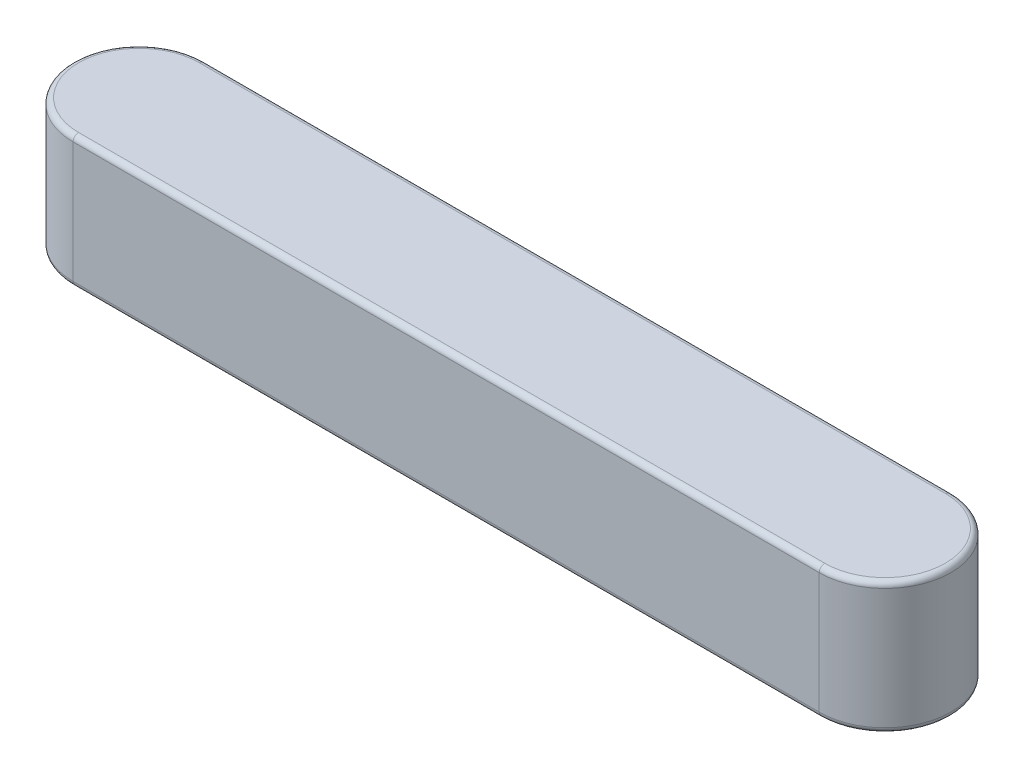
ISO-10303-21;
HEADER;
FILE_DESCRIPTION(('STEP AP214'),'2;1');
FILE_NAME('part.step','',(''),(''),'','','');
FILE_SCHEMA(('AUTOMOTIVE_DESIGN { 1 0 10303 214 1 1 1 1 }'));
ENDSEC;
DATA;
#1=APPLICATION_CONTEXT('core data for automotive mechanical design processes');
#2=APPLICATION_PROTOCOL_DEFINITION('international standard','automotive_design',2000,#1);
#3=PRODUCT_CONTEXT('',#1,'mechanical');
#4=PRODUCT('Part','Part','',(#3));
#5=PRODUCT_RELATED_PRODUCT_CATEGORY('part','',(#4));
#6=PRODUCT_DEFINITION_FORMATION('','',#4);
#7=PRODUCT_DEFINITION_CONTEXT('part definition',#1,'design');
#8=PRODUCT_DEFINITION('design','',#6,#7);
#9=PRODUCT_DEFINITION_SHAPE('','',#8);
#10=(LENGTH_UNIT() NAMED_UNIT(*) SI_UNIT(.MILLI.,.METRE.));
#11=(NAMED_UNIT(*) PLANE_ANGLE_UNIT() SI_UNIT($,.RADIAN.));
#12=(NAMED_UNIT(*) SI_UNIT($,.STERADIAN.) SOLID_ANGLE_UNIT());
#13=UNCERTAINTY_MEASURE_WITH_UNIT(LENGTH_MEASURE(1.E-05),#10,'distance_accuracy_value','');
#14=(GEOMETRIC_REPRESENTATION_CONTEXT(3) GLOBAL_UNCERTAINTY_ASSIGNED_CONTEXT((#13)) GLOBAL_UNIT_ASSIGNED_CONTEXT((#10,
#11,#12)) REPRESENTATION_CONTEXT('',''));
#15=CARTESIAN_POINT('',(0.,0.,0.));
#16=DIRECTION('',(0.,0.,1.));
#17=DIRECTION('',(1.,0.,0.));
#18=AXIS2_PLACEMENT_3D('',#15,#16,#17);
#19=CARTESIAN_POINT('',(-34.,6.,0.));
#20=DIRECTION('',(0.,-1.,0.));
#21=DIRECTION('',(0.,0.,-1.));
#22=AXIS2_PLACEMENT_3D('',#19,#20,#21);
#23=CYLINDRICAL_SURFACE('',#22,3.);
#24=DIRECTION('',(0.,-1.,0.));
#25=VECTOR('',#24,1.);
#26=CARTESIAN_POINT('',(-34.,6.,-3.));
#27=LINE('',#26,#25);
#28=CARTESIAN_POINT('',(-34.,5.75,-3.));
#29=VERTEX_POINT('',#28);
#30=CARTESIAN_POINT('',(-34.,0.25,-3.));
#31=VERTEX_POINT('',#30);
#32=EDGE_CURVE('E105',#29,#31,#27,.T.);
#33=ORIENTED_EDGE('',*,*,#32,.T.);
#34=CARTESIAN_POINT('',(-34.,0.25,0.));
#35=DIRECTION('',(0.,1.,0.));
#36=DIRECTION('',(0.,0.,1.));
#37=AXIS2_PLACEMENT_3D('',#34,#35,#36);
#38=CIRCLE('',#37,3.);
#39=CARTESIAN_POINT('',(-34.,0.25,3.));
#40=VERTEX_POINT('',#39);
#41=EDGE_CURVE('E112',#31,#40,#38,.T.);
#42=ORIENTED_EDGE('',*,*,#41,.T.);
#43=DIRECTION('',(0.,-1.,0.));
#44=VECTOR('',#43,1.);
#45=CARTESIAN_POINT('',(-34.,6.,3.));
#46=LINE('',#45,#44);
#47=CARTESIAN_POINT('',(-34.,5.75,3.));
#48=VERTEX_POINT('',#47);
#49=EDGE_CURVE('E107',#48,#40,#46,.T.);
#50=ORIENTED_EDGE('',*,*,#49,.F.);
#51=CARTESIAN_POINT('',(-34.,5.75,0.));
#52=DIRECTION('',(0.,1.,0.));
#53=DIRECTION('',(0.,0.,1.));
#54=AXIS2_PLACEMENT_3D('',#51,#52,#53);
#55=CIRCLE('',#54,3.);
#56=EDGE_CURVE('E103',#48,#29,#55,.F.);
#57=ORIENTED_EDGE('',*,*,#56,.T.);
#58=EDGE_LOOP('',(#33,#42,#50,#57));
#59=FACE_BOUND('',#58,.T.);
#60=ADVANCED_FACE('F34',(#59),#23,.T.);
#61=CARTESIAN_POINT('',(-34.,6.,3.));
#62=DIRECTION('',(0.,0.,-1.));
#63=DIRECTION('',(-1.,0.,0.));
#64=AXIS2_PLACEMENT_3D('',#61,#62,#63);
#65=PLANE('',#64);
#66=ORIENTED_EDGE('',*,*,#49,.T.);
#67=DIRECTION('',(1.,0.,0.));
#68=VECTOR('',#67,1.);
#69=CARTESIAN_POINT('',(-34.,0.25,3.));
#70=LINE('',#69,#68);
#71=CARTESIAN_POINT('',(0.,0.25,3.));
#72=VERTEX_POINT('',#71);
#73=EDGE_CURVE('E156',#40,#72,#70,.T.);
#74=ORIENTED_EDGE('',*,*,#73,.T.);
#75=DIRECTION('',(0.,-1.,0.));
#76=VECTOR('',#75,1.);
#77=CARTESIAN_POINT('',(0.,6.,3.));
#78=LINE('',#77,#76);
#79=CARTESIAN_POINT('',(0.,5.75,3.));
#80=VERTEX_POINT('',#79);
#81=EDGE_CURVE('E137',#80,#72,#78,.T.);
#82=ORIENTED_EDGE('',*,*,#81,.F.);
#83=DIRECTION('',(1.,0.,0.));
#84=VECTOR('',#83,1.);
#85=CARTESIAN_POINT('',(-34.,5.75,3.));
#86=LINE('',#85,#84);
#87=EDGE_CURVE('E154',#80,#48,#86,.F.);
#88=ORIENTED_EDGE('',*,*,#87,.T.);
#89=EDGE_LOOP('',(#66,#74,#82,#88));
#90=FACE_BOUND('',#89,.T.);
#91=ADVANCED_FACE('F182',(#90),#65,.F.);
#92=CARTESIAN_POINT('',(0.,6.,0.));
#93=DIRECTION('',(0.,-1.,0.));
#94=DIRECTION('',(0.,0.,-1.));
#95=AXIS2_PLACEMENT_3D('',#92,#93,#94);
#96=CYLINDRICAL_SURFACE('',#95,3.);
#97=ORIENTED_EDGE('',*,*,#81,.T.);
#98=CARTESIAN_POINT('',(0.,0.25,0.));
#99=DIRECTION('',(0.,1.,0.));
#100=DIRECTION('',(0.,0.,1.));
#101=AXIS2_PLACEMENT_3D('',#98,#99,#100);
#102=CIRCLE('',#101,3.);
#103=CARTESIAN_POINT('',(0.,0.25,-3.));
#104=VERTEX_POINT('',#103);
#105=EDGE_CURVE('E113',#72,#104,#102,.T.);
#106=ORIENTED_EDGE('',*,*,#105,.T.);
#107=DIRECTION('',(0.,-1.,0.));
#108=VECTOR('',#107,1.);
#109=CARTESIAN_POINT('',(0.,6.,-3.));
#110=LINE('',#109,#108);
#111=CARTESIAN_POINT('',(0.,5.75,-3.));
#112=VERTEX_POINT('',#111);
#113=EDGE_CURVE('E124',#112,#104,#110,.T.);
#114=ORIENTED_EDGE('',*,*,#113,.F.);
#115=CARTESIAN_POINT('',(0.,5.75,0.));
#116=DIRECTION('',(0.,1.,0.));
#117=DIRECTION('',(0.,0.,1.));
#118=AXIS2_PLACEMENT_3D('',#115,#116,#117);
#119=CIRCLE('',#118,3.);
#120=EDGE_CURVE('E149',#112,#80,#119,.F.);
#121=ORIENTED_EDGE('',*,*,#120,.T.);
#122=EDGE_LOOP('',(#97,#106,#114,#121));
#123=FACE_BOUND('',#122,.T.);
#124=ADVANCED_FACE('F180',(#123),#96,.T.);
#125=CARTESIAN_POINT('',(-34.,6.,-3.));
#126=DIRECTION('',(0.,0.,1.));
#127=DIRECTION('',(1.,0.,0.));
#128=AXIS2_PLACEMENT_3D('',#125,#126,#127);
#129=PLANE('',#128);
#130=ORIENTED_EDGE('',*,*,#113,.T.);
#131=DIRECTION('',(-1.,0.,0.));
#132=VECTOR('',#131,1.);
#133=CARTESIAN_POINT('',(-34.,0.25,-3.));
#134=LINE('',#133,#132);
#135=EDGE_CURVE('E123',#104,#31,#134,.T.);
#136=ORIENTED_EDGE('',*,*,#135,.T.);
#137=ORIENTED_EDGE('',*,*,#32,.F.);
#138=DIRECTION('',(-1.,0.,0.));
#139=VECTOR('',#138,1.);
#140=CARTESIAN_POINT('',(0.,5.75,-3.));
#141=LINE('',#140,#139);
#142=EDGE_CURVE('E120',#29,#112,#141,.F.);
#143=ORIENTED_EDGE('',*,*,#142,.T.);
#144=EDGE_LOOP('',(#130,#136,#137,#143));
#145=FACE_BOUND('',#144,.T.);
#146=ADVANCED_FACE('F118',(#145),#129,.F.);
#147=CARTESIAN_POINT('',(-34.,6.,0.));
#148=DIRECTION('',(0.,1.,0.));
#149=DIRECTION('',(0.,0.,1.));
#150=AXIS2_PLACEMENT_3D('',#147,#148,#149);
#151=PLANE('',#150);
#152=DIRECTION('',(1.,0.,0.));
#153=VECTOR('',#152,1.);
#154=CARTESIAN_POINT('',(0.,6.,2.75));
#155=LINE('',#154,#153);
#156=CARTESIAN_POINT('',(-34.,6.,2.75));
#157=VERTEX_POINT('',#156);
#158=CARTESIAN_POINT('',(0.,6.,2.75));
#159=VERTEX_POINT('',#158);
#160=EDGE_CURVE('E43',#157,#159,#155,.T.);
#161=ORIENTED_EDGE('',*,*,#160,.T.);
#162=CARTESIAN_POINT('',(0.,6.,0.));
#163=DIRECTION('',(0.,1.,0.));
#164=DIRECTION('',(0.,0.,1.));
#165=AXIS2_PLACEMENT_3D('',#162,#163,#164);
#166=CIRCLE('',#165,2.75);
#167=CARTESIAN_POINT('',(0.,6.,-2.75));
#168=VERTEX_POINT('',#167);
#169=EDGE_CURVE('E11',#159,#168,#166,.T.);
#170=ORIENTED_EDGE('',*,*,#169,.T.);
#171=DIRECTION('',(-1.,0.,0.));
#172=VECTOR('',#171,1.);
#173=CARTESIAN_POINT('',(-34.,6.,-2.75));
#174=LINE('',#173,#172);
#175=CARTESIAN_POINT('',(-34.,6.,-2.75));
#176=VERTEX_POINT('',#175);
#177=EDGE_CURVE('E159',#168,#176,#174,.T.);
#178=ORIENTED_EDGE('',*,*,#177,.T.);
#179=CARTESIAN_POINT('',(-34.,6.,0.));
#180=DIRECTION('',(0.,1.,0.));
#181=DIRECTION('',(0.,0.,1.));
#182=AXIS2_PLACEMENT_3D('',#179,#180,#181);
#183=CIRCLE('',#182,2.75);
#184=EDGE_CURVE('E130',#176,#157,#183,.T.);
#185=ORIENTED_EDGE('',*,*,#184,.T.);
#186=EDGE_LOOP('',(#161,#170,#178,#185));
#187=FACE_BOUND('',#186,.T.);
#188=ADVANCED_FACE('F205',(#187),#151,.T.);
#189=CARTESIAN_POINT('',(-34.,0.,0.));
#190=DIRECTION('',(0.,1.,0.));
#191=DIRECTION('',(0.,0.,1.));
#192=AXIS2_PLACEMENT_3D('',#189,#190,#191);
#193=PLANE('',#192);
#194=CARTESIAN_POINT('',(-34.,0.,0.));
#195=DIRECTION('',(0.,1.,0.));
#196=DIRECTION('',(0.,0.,1.));
#197=AXIS2_PLACEMENT_3D('',#194,#195,#196);
#198=CIRCLE('',#197,2.75);
#199=CARTESIAN_POINT('',(-34.,0.,2.75));
#200=VERTEX_POINT('',#199);
#201=CARTESIAN_POINT('',(-34.,0.,-2.75));
#202=VERTEX_POINT('',#201);
#203=EDGE_CURVE('E142',#200,#202,#198,.F.);
#204=ORIENTED_EDGE('',*,*,#203,.T.);
#205=DIRECTION('',(-1.,0.,0.));
#206=VECTOR('',#205,1.);
#207=CARTESIAN_POINT('',(-34.,0.,-2.75));
#208=LINE('',#207,#206);
#209=CARTESIAN_POINT('',(0.,0.,-2.75));
#210=VERTEX_POINT('',#209);
#211=EDGE_CURVE('E146',#202,#210,#208,.F.);
#212=ORIENTED_EDGE('',*,*,#211,.T.);
#213=CARTESIAN_POINT('',(0.,0.,0.));
#214=DIRECTION('',(0.,1.,0.));
#215=DIRECTION('',(0.,0.,1.));
#216=AXIS2_PLACEMENT_3D('',#213,#214,#215);
#217=CIRCLE('',#216,2.75);
#218=CARTESIAN_POINT('',(0.,0.,2.75));
#219=VERTEX_POINT('',#218);
#220=EDGE_CURVE('E144',#210,#219,#217,.F.);
#221=ORIENTED_EDGE('',*,*,#220,.T.);
#222=DIRECTION('',(1.,0.,0.));
#223=VECTOR('',#222,1.);
#224=CARTESIAN_POINT('',(-34.,0.,2.75));
#225=LINE('',#224,#223);
#226=EDGE_CURVE('E135',#219,#200,#225,.F.);
#227=ORIENTED_EDGE('',*,*,#226,.T.);
#228=EDGE_LOOP('',(#204,#212,#221,#227));
#229=FACE_BOUND('',#228,.T.);
#230=ADVANCED_FACE('F203',(#229),#193,.F.);
#231=CARTESIAN_POINT('',(-34.,0.25,2.75));
#232=DIRECTION('',(1.,0.,0.));
#233=DIRECTION('',(0.,0.,-1.));
#234=AXIS2_PLACEMENT_3D('',#231,#232,#233);
#235=CYLINDRICAL_SURFACE('',#234,0.25);
#236=CARTESIAN_POINT('',(-34.,0.25,2.75));
#237=DIRECTION('',(-1.,0.,0.));
#238=DIRECTION('',(0.,0.,1.));
#239=AXIS2_PLACEMENT_3D('',#236,#237,#238);
#240=CIRCLE('',#239,0.25);
#241=EDGE_CURVE('E166',#200,#40,#240,.T.);
#242=ORIENTED_EDGE('',*,*,#241,.F.);
#243=ORIENTED_EDGE('',*,*,#226,.F.);
#244=CARTESIAN_POINT('',(0.,0.25,2.75));
#245=DIRECTION('',(1.,0.,0.));
#246=DIRECTION('',(0.,0.,-1.));
#247=AXIS2_PLACEMENT_3D('',#244,#245,#246);
#248=CIRCLE('',#247,0.25);
#249=EDGE_CURVE('E125',#72,#219,#248,.T.);
#250=ORIENTED_EDGE('',*,*,#249,.F.);
#251=ORIENTED_EDGE('',*,*,#73,.F.);
#252=EDGE_LOOP('',(#242,#243,#250,#251));
#253=FACE_BOUND('',#252,.T.);
#254=ADVANCED_FACE('F200',(#253),#235,.T.);
#255=CARTESIAN_POINT('',(0.,0.25,0.));
#256=DIRECTION('',(0.,1.,0.));
#257=DIRECTION('',(0.,0.,1.));
#258=AXIS2_PLACEMENT_3D('',#255,#256,#257);
#259=TOROIDAL_SURFACE('',#258,2.75,0.25);
#260=ORIENTED_EDGE('',*,*,#249,.T.);
#261=ORIENTED_EDGE('',*,*,#220,.F.);
#262=CARTESIAN_POINT('',(0.,0.25,-2.75));
#263=DIRECTION('',(-1.,0.,0.));
#264=DIRECTION('',(0.,0.,1.));
#265=AXIS2_PLACEMENT_3D('',#262,#263,#264);
#266=CIRCLE('',#265,0.25);
#267=EDGE_CURVE('E164',#104,#210,#266,.T.);
#268=ORIENTED_EDGE('',*,*,#267,.F.);
#269=ORIENTED_EDGE('',*,*,#105,.F.);
#270=EDGE_LOOP('',(#260,#261,#268,#269));
#271=FACE_BOUND('',#270,.T.);
#272=ADVANCED_FACE('F189',(#271),#259,.T.);
#273=CARTESIAN_POINT('',(-34.,0.25,0.));
#274=DIRECTION('',(0.,1.,0.));
#275=DIRECTION('',(0.,0.,1.));
#276=AXIS2_PLACEMENT_3D('',#273,#274,#275);
#277=TOROIDAL_SURFACE('',#276,2.75,0.25);
#278=ORIENTED_EDGE('',*,*,#241,.T.);
#279=ORIENTED_EDGE('',*,*,#41,.F.);
#280=CARTESIAN_POINT('',(-34.,0.25,-2.75));
#281=DIRECTION('',(1.,0.,0.));
#282=DIRECTION('',(0.,0.,-1.));
#283=AXIS2_PLACEMENT_3D('',#280,#281,#282);
#284=CIRCLE('',#283,0.25);
#285=EDGE_CURVE('E162',#202,#31,#284,.T.);
#286=ORIENTED_EDGE('',*,*,#285,.F.);
#287=ORIENTED_EDGE('',*,*,#203,.F.);
#288=EDGE_LOOP('',(#278,#279,#286,#287));
#289=FACE_BOUND('',#288,.T.);
#290=ADVANCED_FACE('F197',(#289),#277,.T.);
#291=CARTESIAN_POINT('',(-34.,0.25,-2.75));
#292=DIRECTION('',(-1.,0.,0.));
#293=DIRECTION('',(0.,0.,1.));
#294=AXIS2_PLACEMENT_3D('',#291,#292,#293);
#295=CYLINDRICAL_SURFACE('',#294,0.25);
#296=ORIENTED_EDGE('',*,*,#267,.T.);
#297=ORIENTED_EDGE('',*,*,#211,.F.);
#298=ORIENTED_EDGE('',*,*,#285,.T.);
#299=ORIENTED_EDGE('',*,*,#135,.F.);
#300=EDGE_LOOP('',(#296,#297,#298,#299));
#301=FACE_BOUND('',#300,.T.);
#302=ADVANCED_FACE('F192',(#301),#295,.T.);
#303=CARTESIAN_POINT('',(-34.,5.75,0.));
#304=DIRECTION('',(0.,1.,0.));
#305=DIRECTION('',(0.,0.,1.));
#306=AXIS2_PLACEMENT_3D('',#303,#304,#305);
#307=TOROIDAL_SURFACE('',#306,2.75,0.25);
#308=CARTESIAN_POINT('',(-34.,5.75,-2.75));
#309=DIRECTION('',(1.,0.,0.));
#310=DIRECTION('',(0.,0.,-1.));
#311=AXIS2_PLACEMENT_3D('',#308,#309,#310);
#312=CIRCLE('',#311,0.25);
#313=EDGE_CURVE('E129',#29,#176,#312,.T.);
#314=ORIENTED_EDGE('',*,*,#313,.F.);
#315=ORIENTED_EDGE('',*,*,#56,.F.);
#316=CARTESIAN_POINT('',(-34.,5.75,2.75));
#317=DIRECTION('',(1.,0.,0.));
#318=DIRECTION('',(0.,0.,-1.));
#319=AXIS2_PLACEMENT_3D('',#316,#317,#318);
#320=CIRCLE('',#319,0.25);
#321=EDGE_CURVE('E38',#157,#48,#320,.T.);
#322=ORIENTED_EDGE('',*,*,#321,.F.);
#323=ORIENTED_EDGE('',*,*,#184,.F.);
#324=EDGE_LOOP('',(#314,#315,#322,#323));
#325=FACE_BOUND('',#324,.T.);
#326=ADVANCED_FACE('F36',(#325),#307,.T.);
#327=CARTESIAN_POINT('',(-34.,5.75,2.75));
#328=DIRECTION('',(-1.,0.,0.));
#329=DIRECTION('',(0.,0.,1.));
#330=AXIS2_PLACEMENT_3D('',#327,#328,#329);
#331=CYLINDRICAL_SURFACE('',#330,0.25);
#332=ORIENTED_EDGE('',*,*,#321,.T.);
#333=ORIENTED_EDGE('',*,*,#87,.F.);
#334=CARTESIAN_POINT('',(0.,5.75,2.75));
#335=DIRECTION('',(1.,0.,0.));
#336=DIRECTION('',(0.,0.,-1.));
#337=AXIS2_PLACEMENT_3D('',#334,#335,#336);
#338=CIRCLE('',#337,0.25);
#339=EDGE_CURVE('E132',#159,#80,#338,.T.);
#340=ORIENTED_EDGE('',*,*,#339,.F.);
#341=ORIENTED_EDGE('',*,*,#160,.F.);
#342=EDGE_LOOP('',(#332,#333,#340,#341));
#343=FACE_BOUND('',#342,.T.);
#344=ADVANCED_FACE('F175',(#343),#331,.T.);
#345=CARTESIAN_POINT('',(-34.,5.75,-2.75));
#346=DIRECTION('',(1.,0.,0.));
#347=DIRECTION('',(0.,0.,-1.));
#348=AXIS2_PLACEMENT_3D('',#345,#346,#347);
#349=CYLINDRICAL_SURFACE('',#348,0.25);
#350=ORIENTED_EDGE('',*,*,#313,.T.);
#351=ORIENTED_EDGE('',*,*,#177,.F.);
#352=CARTESIAN_POINT('',(0.,5.75,-2.75));
#353=DIRECTION('',(1.,0.,0.));
#354=DIRECTION('',(0.,0.,-1.));
#355=AXIS2_PLACEMENT_3D('',#352,#353,#354);
#356=CIRCLE('',#355,0.25);
#357=EDGE_CURVE('E57',#112,#168,#356,.T.);
#358=ORIENTED_EDGE('',*,*,#357,.F.);
#359=ORIENTED_EDGE('',*,*,#142,.F.);
#360=EDGE_LOOP('',(#350,#351,#358,#359));
#361=FACE_BOUND('',#360,.T.);
#362=ADVANCED_FACE('F133',(#361),#349,.T.);
#363=CARTESIAN_POINT('',(0.,5.75,0.));
#364=DIRECTION('',(0.,1.,0.));
#365=DIRECTION('',(0.,0.,1.));
#366=AXIS2_PLACEMENT_3D('',#363,#364,#365);
#367=TOROIDAL_SURFACE('',#366,2.75,0.25);
#368=ORIENTED_EDGE('',*,*,#339,.T.);
#369=ORIENTED_EDGE('',*,*,#120,.F.);
#370=ORIENTED_EDGE('',*,*,#357,.T.);
#371=ORIENTED_EDGE('',*,*,#169,.F.);
#372=EDGE_LOOP('',(#368,#369,#370,#371));
#373=FACE_BOUND('',#372,.T.);
#374=ADVANCED_FACE('F173',(#373),#367,.T.);
#375=CLOSED_SHELL('',(#60,#91,#124,#146,#188,#230,#254,#272,#290,#302,#326,#344,#362,#374));
#376=MANIFOLD_SOLID_BREP('B2',#375);
#377=ADVANCED_BREP_SHAPE_REPRESENTATION('',(#18,#376),#14);
#378=SHAPE_DEFINITION_REPRESENTATION(#9,#377);
ENDSEC;
END-ISO-10303-21;
